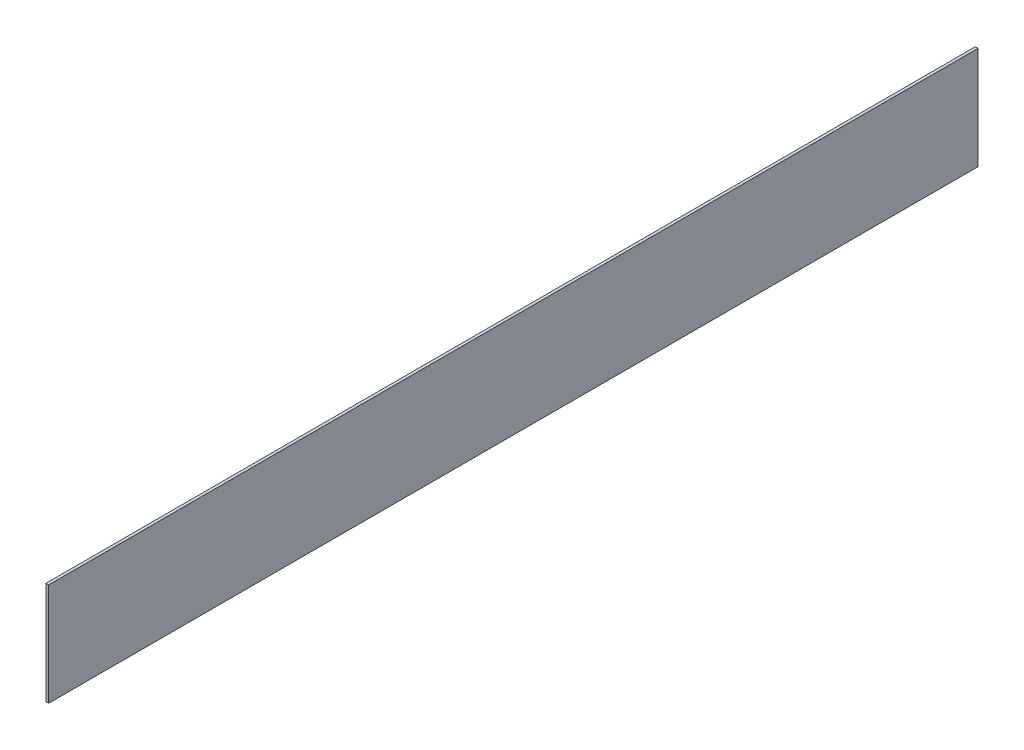
ISO-10303-21;
HEADER;
FILE_DESCRIPTION(('STEP AP214'),'2;1');
FILE_NAME('part.step','',(''),(''),'','','');
FILE_SCHEMA(('AUTOMOTIVE_DESIGN { 1 0 10303 214 1 1 1 1 }'));
ENDSEC;
DATA;
#1=APPLICATION_CONTEXT('core data for automotive mechanical design processes');
#2=APPLICATION_PROTOCOL_DEFINITION('international standard','automotive_design',2000,#1);
#3=PRODUCT_CONTEXT('',#1,'mechanical');
#4=PRODUCT('Part','Part','',(#3));
#5=PRODUCT_RELATED_PRODUCT_CATEGORY('part','',(#4));
#6=PRODUCT_DEFINITION_FORMATION('','',#4);
#7=PRODUCT_DEFINITION_CONTEXT('part definition',#1,'design');
#8=PRODUCT_DEFINITION('design','',#6,#7);
#9=PRODUCT_DEFINITION_SHAPE('','',#8);
#10=(LENGTH_UNIT() NAMED_UNIT(*) SI_UNIT(.MILLI.,.METRE.));
#11=(NAMED_UNIT(*) PLANE_ANGLE_UNIT() SI_UNIT($,.RADIAN.));
#12=(NAMED_UNIT(*) SI_UNIT($,.STERADIAN.) SOLID_ANGLE_UNIT());
#13=UNCERTAINTY_MEASURE_WITH_UNIT(LENGTH_MEASURE(1.E-05),#10,'distance_accuracy_value','');
#14=(GEOMETRIC_REPRESENTATION_CONTEXT(3) GLOBAL_UNCERTAINTY_ASSIGNED_CONTEXT((#13)) GLOBAL_UNIT_ASSIGNED_CONTEXT((#10,
#11,#12)) REPRESENTATION_CONTEXT('',''));
#15=CARTESIAN_POINT('',(0.,0.,0.));
#16=DIRECTION('',(0.,0.,1.));
#17=DIRECTION('',(1.,0.,0.));
#18=AXIS2_PLACEMENT_3D('',#15,#16,#17);
#19=CARTESIAN_POINT('',(0.4,-7.50000000000002,68.0000000000001));
#20=DIRECTION('',(0.,0.,-1.));
#21=DIRECTION('',(-1.,0.,0.));
#22=AXIS2_PLACEMENT_3D('',#19,#20,#21);
#23=PLANE('',#22);
#24=DIRECTION('',(0.,-1.,0.));
#25=VECTOR('',#24,1.);
#26=CARTESIAN_POINT('',(0.,-7.50000000000002,68.0000000000001));
#27=LINE('',#26,#25);
#28=CARTESIAN_POINT('',(0.,7.50000000000001,68.0000000000001));
#29=VERTEX_POINT('',#28);
#30=CARTESIAN_POINT('',(0.,-7.50000000000002,68.0000000000001));
#31=VERTEX_POINT('',#30);
#32=EDGE_CURVE('E102',#29,#31,#27,.T.);
#33=ORIENTED_EDGE('',*,*,#32,.T.);
#34=DIRECTION('',(-1.,0.,0.));
#35=VECTOR('',#34,1.);
#36=CARTESIAN_POINT('',(0.4,-7.50000000000002,68.0000000000001));
#37=LINE('',#36,#35);
#38=CARTESIAN_POINT('',(0.4,-7.50000000000002,68.0000000000001));
#39=VERTEX_POINT('',#38);
#40=EDGE_CURVE('E11',#39,#31,#37,.T.);
#41=ORIENTED_EDGE('',*,*,#40,.F.);
#42=DIRECTION('',(0.,-1.,0.));
#43=VECTOR('',#42,1.);
#44=CARTESIAN_POINT('',(0.4,-7.50000000000002,68.0000000000001));
#45=LINE('',#44,#43);
#46=CARTESIAN_POINT('',(0.4,7.50000000000001,68.0000000000001));
#47=VERTEX_POINT('',#46);
#48=EDGE_CURVE('E90',#47,#39,#45,.T.);
#49=ORIENTED_EDGE('',*,*,#48,.F.);
#50=DIRECTION('',(-1.,0.,0.));
#51=VECTOR('',#50,1.);
#52=CARTESIAN_POINT('',(0.4,7.50000000000001,68.0000000000001));
#53=LINE('',#52,#51);
#54=EDGE_CURVE('E98',#47,#29,#53,.T.);
#55=ORIENTED_EDGE('',*,*,#54,.T.);
#56=EDGE_LOOP('',(#33,#41,#49,#55));
#57=FACE_BOUND('',#56,.T.);
#58=ADVANCED_FACE('F39',(#57),#23,.F.);
#59=CARTESIAN_POINT('',(0.4,-7.5,-67.9999999999999));
#60=DIRECTION('',(0.,1.,0.));
#61=DIRECTION('',(0.,0.,1.));
#62=AXIS2_PLACEMENT_3D('',#59,#60,#61);
#63=PLANE('',#62);
#64=DIRECTION('',(0.,0.,-1.));
#65=VECTOR('',#64,1.);
#66=CARTESIAN_POINT('',(0.,-7.5,-67.9999999999999));
#67=LINE('',#66,#65);
#68=CARTESIAN_POINT('',(0.,-7.5,-67.9999999999999));
#69=VERTEX_POINT('',#68);
#70=EDGE_CURVE('E94',#31,#69,#67,.T.);
#71=ORIENTED_EDGE('',*,*,#70,.T.);
#72=DIRECTION('',(-1.,0.,0.));
#73=VECTOR('',#72,1.);
#74=CARTESIAN_POINT('',(0.4,-7.5,-67.9999999999999));
#75=LINE('',#74,#73);
#76=CARTESIAN_POINT('',(0.4,-7.5,-67.9999999999999));
#77=VERTEX_POINT('',#76);
#78=EDGE_CURVE('E47',#77,#69,#75,.T.);
#79=ORIENTED_EDGE('',*,*,#78,.F.);
#80=DIRECTION('',(0.,0.,-1.));
#81=VECTOR('',#80,1.);
#82=CARTESIAN_POINT('',(0.4,-7.5,-67.9999999999999));
#83=LINE('',#82,#81);
#84=EDGE_CURVE('E85',#39,#77,#83,.T.);
#85=ORIENTED_EDGE('',*,*,#84,.F.);
#86=ORIENTED_EDGE('',*,*,#40,.T.);
#87=EDGE_LOOP('',(#71,#79,#85,#86));
#88=FACE_BOUND('',#87,.T.);
#89=ADVANCED_FACE('F93',(#88),#63,.F.);
#90=CARTESIAN_POINT('',(0.4,-7.5,-67.9999999999999));
#91=DIRECTION('',(0.,0.,1.));
#92=DIRECTION('',(1.,0.,0.));
#93=AXIS2_PLACEMENT_3D('',#90,#91,#92);
#94=PLANE('',#93);
#95=DIRECTION('',(0.,1.,0.));
#96=VECTOR('',#95,1.);
#97=CARTESIAN_POINT('',(0.,-7.5,-67.9999999999999));
#98=LINE('',#97,#96);
#99=CARTESIAN_POINT('',(0.,7.5,-67.9999999999999));
#100=VERTEX_POINT('',#99);
#101=EDGE_CURVE('E72',#69,#100,#98,.T.);
#102=ORIENTED_EDGE('',*,*,#101,.T.);
#103=DIRECTION('',(-1.,0.,0.));
#104=VECTOR('',#103,1.);
#105=CARTESIAN_POINT('',(0.4,7.5,-67.9999999999999));
#106=LINE('',#105,#104);
#107=CARTESIAN_POINT('',(0.4,7.5,-67.9999999999999));
#108=VERTEX_POINT('',#107);
#109=EDGE_CURVE('E95',#108,#100,#106,.T.);
#110=ORIENTED_EDGE('',*,*,#109,.F.);
#111=DIRECTION('',(0.,1.,0.));
#112=VECTOR('',#111,1.);
#113=CARTESIAN_POINT('',(0.4,-7.5,-67.9999999999999));
#114=LINE('',#113,#112);
#115=EDGE_CURVE('E88',#77,#108,#114,.T.);
#116=ORIENTED_EDGE('',*,*,#115,.F.);
#117=ORIENTED_EDGE('',*,*,#78,.T.);
#118=EDGE_LOOP('',(#102,#110,#116,#117));
#119=FACE_BOUND('',#118,.T.);
#120=ADVANCED_FACE('F96',(#119),#94,.F.);
#121=CARTESIAN_POINT('',(0.4,7.5,-67.9999999999999));
#122=DIRECTION('',(0.,-1.,0.));
#123=DIRECTION('',(0.,0.,-1.));
#124=AXIS2_PLACEMENT_3D('',#121,#122,#123);
#125=PLANE('',#124);
#126=DIRECTION('',(0.,0.,1.));
#127=VECTOR('',#126,1.);
#128=CARTESIAN_POINT('',(0.,7.5,-67.9999999999999));
#129=LINE('',#128,#127);
#130=EDGE_CURVE('E78',#100,#29,#129,.T.);
#131=ORIENTED_EDGE('',*,*,#130,.T.);
#132=ORIENTED_EDGE('',*,*,#54,.F.);
#133=DIRECTION('',(0.,0.,1.));
#134=VECTOR('',#133,1.);
#135=CARTESIAN_POINT('',(0.4,7.5,-67.9999999999999));
#136=LINE('',#135,#134);
#137=EDGE_CURVE('E55',#108,#47,#136,.T.);
#138=ORIENTED_EDGE('',*,*,#137,.F.);
#139=ORIENTED_EDGE('',*,*,#109,.T.);
#140=EDGE_LOOP('',(#131,#132,#138,#139));
#141=FACE_BOUND('',#140,.T.);
#142=ADVANCED_FACE('F109',(#141),#125,.F.);
#143=CARTESIAN_POINT('',(0.4,0.,0.));
#144=DIRECTION('',(1.,0.,0.));
#145=DIRECTION('',(0.,0.,-1.));
#146=AXIS2_PLACEMENT_3D('',#143,#144,#145);
#147=PLANE('',#146);
#148=ORIENTED_EDGE('',*,*,#48,.T.);
#149=ORIENTED_EDGE('',*,*,#84,.T.);
#150=ORIENTED_EDGE('',*,*,#115,.T.);
#151=ORIENTED_EDGE('',*,*,#137,.T.);
#152=EDGE_LOOP('',(#148,#149,#150,#151));
#153=FACE_BOUND('',#152,.T.);
#154=ADVANCED_FACE('F86',(#153),#147,.T.);
#155=CARTESIAN_POINT('',(0.,0.,0.));
#156=DIRECTION('',(1.,0.,0.));
#157=DIRECTION('',(0.,0.,-1.));
#158=AXIS2_PLACEMENT_3D('',#155,#156,#157);
#159=PLANE('',#158);
#160=ORIENTED_EDGE('',*,*,#32,.F.);
#161=ORIENTED_EDGE('',*,*,#130,.F.);
#162=ORIENTED_EDGE('',*,*,#101,.F.);
#163=ORIENTED_EDGE('',*,*,#70,.F.);
#164=EDGE_LOOP('',(#160,#161,#162,#163));
#165=FACE_BOUND('',#164,.T.);
#166=ADVANCED_FACE('F112',(#165),#159,.F.);
#167=CLOSED_SHELL('',(#58,#89,#120,#142,#154,#166));
#168=MANIFOLD_SOLID_BREP('B2',#167);
#169=ADVANCED_BREP_SHAPE_REPRESENTATION('',(#18,#168),#14);
#170=SHAPE_DEFINITION_REPRESENTATION(#9,#169);
ENDSEC;
END-ISO-10303-21;
